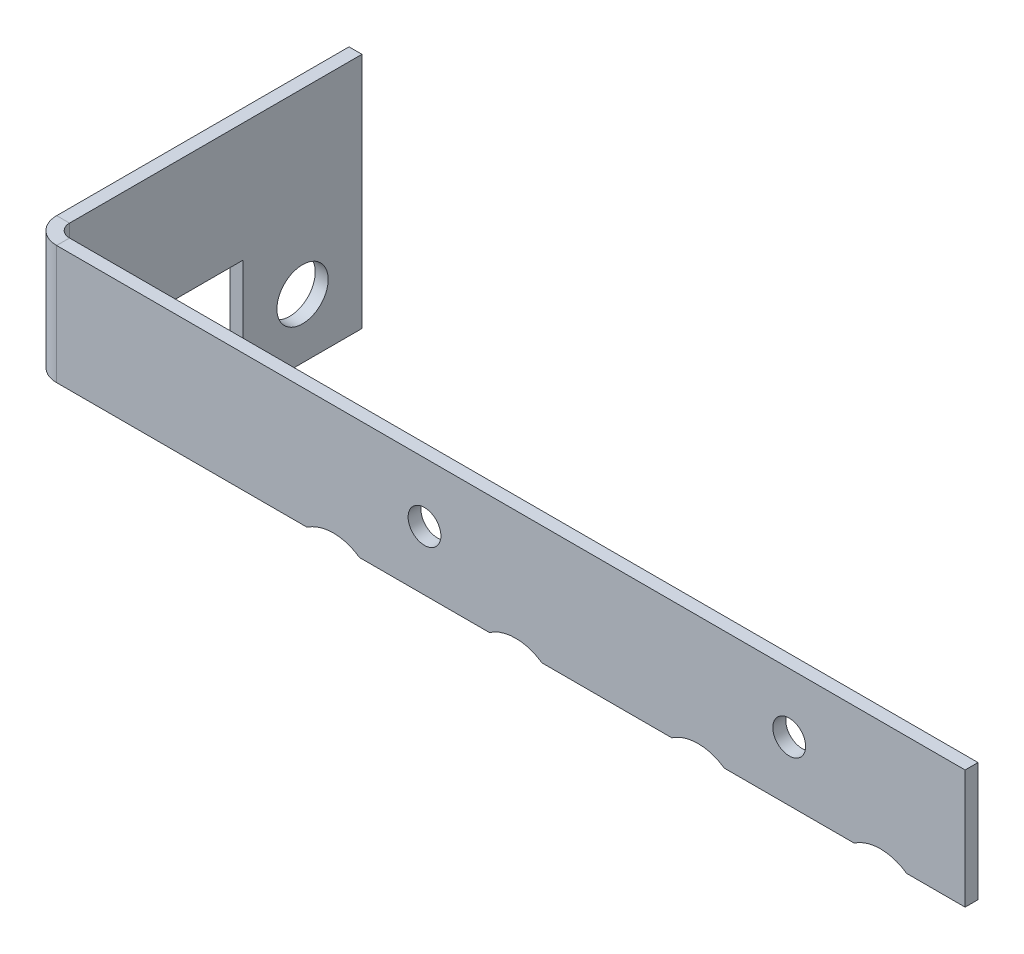
ISO-10303-21;
HEADER;
FILE_DESCRIPTION(('STEP AP214'),'2;1');
FILE_NAME('part.step','',(''),(''),'','','');
FILE_SCHEMA(('AUTOMOTIVE_DESIGN { 1 0 10303 214 1 1 1 1 }'));
ENDSEC;
DATA;
#1=APPLICATION_CONTEXT('core data for automotive mechanical design processes');
#2=APPLICATION_PROTOCOL_DEFINITION('international standard','automotive_design',2000,#1);
#3=PRODUCT_CONTEXT('',#1,'mechanical');
#4=PRODUCT('Part','Part','',(#3));
#5=PRODUCT_RELATED_PRODUCT_CATEGORY('part','',(#4));
#6=PRODUCT_DEFINITION_FORMATION('','',#4);
#7=PRODUCT_DEFINITION_CONTEXT('part definition',#1,'design');
#8=PRODUCT_DEFINITION('design','',#6,#7);
#9=PRODUCT_DEFINITION_SHAPE('','',#8);
#10=(LENGTH_UNIT() NAMED_UNIT(*) SI_UNIT(.MILLI.,.METRE.));
#11=(NAMED_UNIT(*) PLANE_ANGLE_UNIT() SI_UNIT($,.RADIAN.));
#12=(NAMED_UNIT(*) SI_UNIT($,.STERADIAN.) SOLID_ANGLE_UNIT());
#13=UNCERTAINTY_MEASURE_WITH_UNIT(LENGTH_MEASURE(1.E-05),#10,'distance_accuracy_value','');
#14=(GEOMETRIC_REPRESENTATION_CONTEXT(3) GLOBAL_UNCERTAINTY_ASSIGNED_CONTEXT((#13)) GLOBAL_UNIT_ASSIGNED_CONTEXT((#10,
#11,#12)) REPRESENTATION_CONTEXT('',''));
#15=CARTESIAN_POINT('',(0.,0.,0.));
#16=DIRECTION('',(0.,0.,1.));
#17=DIRECTION('',(1.,0.,0.));
#18=AXIS2_PLACEMENT_3D('',#15,#16,#17);
#19=CARTESIAN_POINT('',(-10.5,19.430000002,0.));
#20=DIRECTION('',(0.,1.,0.));
#21=DIRECTION('',(-1.,0.,0.));
#22=AXIS2_PLACEMENT_3D('',#19,#20,#21);
#23=PLANE('',#22);
#24=DIRECTION('',(-1.,0.,0.));
#25=VECTOR('',#24,1.);
#26=CARTESIAN_POINT('',(-10.5,19.430000002,0.));
#27=LINE('',#26,#25);
#28=CARTESIAN_POINT('',(78.3179999999999,19.430000002,0.));
#29=VERTEX_POINT('',#28);
#30=CARTESIAN_POINT('',(-34.299999898,19.430000002,0.));
#31=VERTEX_POINT('',#30);
#32=EDGE_CURVE('E244',#29,#31,#27,.T.);
#33=ORIENTED_EDGE('',*,*,#32,.T.);
#34=DIRECTION('',(0.,0.,1.));
#35=VECTOR('',#34,1.);
#36=CARTESIAN_POINT('',(-34.299999898,19.430000002,0.));
#37=LINE('',#36,#35);
#38=CARTESIAN_POINT('',(-34.299999898,19.430000002,1.600000102));
#39=VERTEX_POINT('',#38);
#40=EDGE_CURVE('E270',#31,#39,#37,.T.);
#41=ORIENTED_EDGE('',*,*,#40,.T.);
#42=DIRECTION('',(1.,0.,0.));
#43=VECTOR('',#42,1.);
#44=CARTESIAN_POINT('',(22.606,19.430000002,1.600000102));
#45=LINE('',#44,#43);
#46=CARTESIAN_POINT('',(78.3179999999999,19.430000002,1.600000102));
#47=VERTEX_POINT('',#46);
#48=EDGE_CURVE('E204',#47,#39,#45,.F.);
#49=ORIENTED_EDGE('',*,*,#48,.F.);
#50=DIRECTION('',(0.,0.,-1.));
#51=VECTOR('',#50,1.);
#52=CARTESIAN_POINT('',(78.3179999999999,19.430000002,0.));
#53=LINE('',#52,#51);
#54=EDGE_CURVE('E226',#47,#29,#53,.T.);
#55=ORIENTED_EDGE('',*,*,#54,.T.);
#56=EDGE_LOOP('',(#33,#41,#49,#55));
#57=FACE_BOUND('',#56,.T.);
#58=ADVANCED_FACE('F38',(#57),#23,.T.);
#59=CARTESIAN_POINT('',(22.606,0.,0.));
#60=DIRECTION('',(0.,0.,1.));
#61=DIRECTION('',(1.,0.,0.));
#62=AXIS2_PLACEMENT_3D('',#59,#60,#61);
#63=PLANE('',#62);
#64=CARTESIAN_POINT('',(56.5149999999999,12.065,0.));
#65=DIRECTION('',(0.,0.,1.));
#66=DIRECTION('',(1.,0.,0.));
#67=AXIS2_PLACEMENT_3D('',#64,#65,#66);
#68=CIRCLE('',#67,2.032);
#69=CARTESIAN_POINT('',(58.5469999999999,12.065,0.));
#70=VERTEX_POINT('',#69);
#71=EDGE_CURVE('E180',#70,#70,#68,.T.);
#72=ORIENTED_EDGE('',*,*,#71,.T.);
#73=EDGE_LOOP('',(#72));
#74=FACE_BOUND('',#73,.T.);
#75=CARTESIAN_POINT('',(11.3029999999999,12.065,0.));
#76=DIRECTION('',(0.,0.,1.));
#77=DIRECTION('',(1.,0.,0.));
#78=AXIS2_PLACEMENT_3D('',#75,#76,#77);
#79=CIRCLE('',#78,2.032);
#80=CARTESIAN_POINT('',(13.3349999999999,12.065,0.));
#81=VERTEX_POINT('',#80);
#82=EDGE_CURVE('E174',#81,#81,#79,.T.);
#83=ORIENTED_EDGE('',*,*,#82,.T.);
#84=EDGE_LOOP('',(#83));
#85=FACE_BOUND('',#84,.T.);
#86=DIRECTION('',(0.,1.,0.));
#87=VECTOR('',#86,1.);
#88=CARTESIAN_POINT('',(-34.299999898,19.430000002,0.));
#89=LINE('',#88,#87);
#90=CARTESIAN_POINT('',(-34.299999898,4.699999998,0.));
#91=VERTEX_POINT('',#90);
#92=EDGE_CURVE('E278',#31,#91,#89,.F.);
#93=ORIENTED_EDGE('',*,*,#92,.F.);
#94=ORIENTED_EDGE('',*,*,#32,.F.);
#95=DIRECTION('',(0.,1.,0.));
#96=VECTOR('',#95,1.);
#97=CARTESIAN_POINT('',(78.3179999999999,4.699999998,0.));
#98=LINE('',#97,#96);
#99=CARTESIAN_POINT('',(78.3179999999999,4.699999998,0.));
#100=VERTEX_POINT('',#99);
#101=EDGE_CURVE('E251',#100,#29,#98,.T.);
#102=ORIENTED_EDGE('',*,*,#101,.F.);
#103=DIRECTION('',(1.,0.,0.));
#104=VECTOR('',#103,1.);
#105=CARTESIAN_POINT('',(71.07109944452,4.699999998,0.));
#106=LINE('',#105,#104);
#107=CARTESIAN_POINT('',(71.07109944452,4.699999998,0.));
#108=VERTEX_POINT('',#107);
#109=EDGE_CURVE('E254',#108,#100,#106,.T.);
#110=ORIENTED_EDGE('',*,*,#109,.F.);
#111=CARTESIAN_POINT('',(67.818,0.,0.));
#112=DIRECTION('',(0.,0.,-1.));
#113=DIRECTION('',(1.,0.,0.));
#114=AXIS2_PLACEMENT_3D('',#111,#112,#113);
#115=CIRCLE('',#114,5.715999998);
#116=CARTESIAN_POINT('',(64.5649005554801,4.699999998,0.));
#117=VERTEX_POINT('',#116);
#118=EDGE_CURVE('E169',#117,#108,#115,.T.);
#119=ORIENTED_EDGE('',*,*,#118,.F.);
#120=DIRECTION('',(1.,0.,0.));
#121=VECTOR('',#120,1.);
#122=CARTESIAN_POINT('',(48.46509944452,4.699999998,0.));
#123=LINE('',#122,#121);
#124=CARTESIAN_POINT('',(48.46509944452,4.699999998,0.));
#125=VERTEX_POINT('',#124);
#126=EDGE_CURVE('E150',#125,#117,#123,.T.);
#127=ORIENTED_EDGE('',*,*,#126,.F.);
#128=CARTESIAN_POINT('',(45.212,0.,0.));
#129=DIRECTION('',(0.,0.,-1.));
#130=DIRECTION('',(1.,0.,0.));
#131=AXIS2_PLACEMENT_3D('',#128,#129,#130);
#132=CIRCLE('',#131,5.715999998);
#133=CARTESIAN_POINT('',(41.95890055548,4.699999998,0.));
#134=VERTEX_POINT('',#133);
#135=EDGE_CURVE('E166',#134,#125,#132,.T.);
#136=ORIENTED_EDGE('',*,*,#135,.F.);
#137=DIRECTION('',(1.,0.,0.));
#138=VECTOR('',#137,1.);
#139=CARTESIAN_POINT('',(25.85909944452,4.699999998,0.));
#140=LINE('',#139,#138);
#141=CARTESIAN_POINT('',(25.85909944452,4.699999998,0.));
#142=VERTEX_POINT('',#141);
#143=EDGE_CURVE('E172',#142,#134,#140,.T.);
#144=ORIENTED_EDGE('',*,*,#143,.F.);
#145=CARTESIAN_POINT('',(22.606,0.,0.));
#146=DIRECTION('',(0.,0.,-1.));
#147=DIRECTION('',(1.,0.,0.));
#148=AXIS2_PLACEMENT_3D('',#145,#146,#147);
#149=CIRCLE('',#148,5.715999998);
#150=CARTESIAN_POINT('',(19.3529005554801,4.699999998,0.));
#151=VERTEX_POINT('',#150);
#152=EDGE_CURVE('E218',#151,#142,#149,.T.);
#153=ORIENTED_EDGE('',*,*,#152,.F.);
#154=DIRECTION('',(1.,0.,0.));
#155=VECTOR('',#154,1.);
#156=CARTESIAN_POINT('',(3.25309944451995,4.699999998,0.));
#157=LINE('',#156,#155);
#158=CARTESIAN_POINT('',(3.25309944451995,4.699999998,0.));
#159=VERTEX_POINT('',#158);
#160=EDGE_CURVE('E242',#159,#151,#157,.T.);
#161=ORIENTED_EDGE('',*,*,#160,.F.);
#162=CARTESIAN_POINT('',(0.,0.,0.));
#163=DIRECTION('',(0.,0.,-1.));
#164=DIRECTION('',(1.,0.,0.));
#165=AXIS2_PLACEMENT_3D('',#162,#163,#164);
#166=CIRCLE('',#165,5.715999998);
#167=CARTESIAN_POINT('',(-3.25309944451995,4.699999998,0.));
#168=VERTEX_POINT('',#167);
#169=EDGE_CURVE('E235',#168,#159,#166,.T.);
#170=ORIENTED_EDGE('',*,*,#169,.F.);
#171=DIRECTION('',(1.,0.,0.));
#172=VECTOR('',#171,1.);
#173=CARTESIAN_POINT('',(-10.5,4.699999998,0.));
#174=LINE('',#173,#172);
#175=EDGE_CURVE('E240',#91,#168,#174,.T.);
#176=ORIENTED_EDGE('',*,*,#175,.F.);
#177=EDGE_LOOP('',(#93,#94,#102,#110,#119,#127,#136,#144,#153,#161,#170,#176));
#178=FACE_BOUND('',#177,.T.);
#179=ADVANCED_FACE('F164',(#74,#85,#178),#63,.F.);
#180=CARTESIAN_POINT('',(22.606,0.,1.600000102));
#181=DIRECTION('',(0.,0.,1.));
#182=DIRECTION('',(1.,0.,0.));
#183=AXIS2_PLACEMENT_3D('',#180,#181,#182);
#184=PLANE('',#183);
#185=CARTESIAN_POINT('',(11.3029999999999,12.065,1.600000102));
#186=DIRECTION('',(0.,0.,1.));
#187=DIRECTION('',(1.,0.,0.));
#188=AXIS2_PLACEMENT_3D('',#185,#186,#187);
#189=CIRCLE('',#188,2.032);
#190=CARTESIAN_POINT('',(13.3349999999999,12.065,1.600000102));
#191=VERTEX_POINT('',#190);
#192=EDGE_CURVE('E191',#191,#191,#189,.T.);
#193=ORIENTED_EDGE('',*,*,#192,.F.);
#194=EDGE_LOOP('',(#193));
#195=FACE_BOUND('',#194,.T.);
#196=CARTESIAN_POINT('',(56.5149999999999,12.065,1.600000102));
#197=DIRECTION('',(0.,0.,1.));
#198=DIRECTION('',(1.,0.,0.));
#199=AXIS2_PLACEMENT_3D('',#196,#197,#198);
#200=CIRCLE('',#199,2.032);
#201=CARTESIAN_POINT('',(58.5469999999999,12.065,1.600000102));
#202=VERTEX_POINT('',#201);
#203=EDGE_CURVE('E215',#202,#202,#200,.T.);
#204=ORIENTED_EDGE('',*,*,#203,.F.);
#205=EDGE_LOOP('',(#204));
#206=FACE_BOUND('',#205,.T.);
#207=ORIENTED_EDGE('',*,*,#48,.T.);
#208=DIRECTION('',(0.,1.,0.));
#209=VECTOR('',#208,1.);
#210=CARTESIAN_POINT('',(-34.299999898,19.430000002,1.600000102));
#211=LINE('',#210,#209);
#212=CARTESIAN_POINT('',(-34.299999898,4.699999998,1.600000102));
#213=VERTEX_POINT('',#212);
#214=EDGE_CURVE('E108',#39,#213,#211,.F.);
#215=ORIENTED_EDGE('',*,*,#214,.T.);
#216=DIRECTION('',(1.,0.,0.));
#217=VECTOR('',#216,1.);
#218=CARTESIAN_POINT('',(22.606,4.699999998,1.600000102));
#219=LINE('',#218,#217);
#220=CARTESIAN_POINT('',(-3.25309944451995,4.699999998,1.600000102));
#221=VERTEX_POINT('',#220);
#222=EDGE_CURVE('E207',#213,#221,#219,.T.);
#223=ORIENTED_EDGE('',*,*,#222,.T.);
#224=CARTESIAN_POINT('',(0.,0.,1.600000102));
#225=DIRECTION('',(0.,0.,-1.));
#226=DIRECTION('',(-1.,0.,0.));
#227=AXIS2_PLACEMENT_3D('',#224,#225,#226);
#228=CIRCLE('',#227,5.715999998);
#229=CARTESIAN_POINT('',(3.25309944451995,4.699999998,1.600000102));
#230=VERTEX_POINT('',#229);
#231=EDGE_CURVE('E209',#221,#230,#228,.T.);
#232=ORIENTED_EDGE('',*,*,#231,.T.);
#233=DIRECTION('',(1.,0.,0.));
#234=VECTOR('',#233,1.);
#235=CARTESIAN_POINT('',(22.606,4.699999998,1.600000102));
#236=LINE('',#235,#234);
#237=CARTESIAN_POINT('',(19.3529005554801,4.699999998,1.600000102));
#238=VERTEX_POINT('',#237);
#239=EDGE_CURVE('E186',#230,#238,#236,.T.);
#240=ORIENTED_EDGE('',*,*,#239,.T.);
#241=CARTESIAN_POINT('',(22.606,0.,1.600000102));
#242=DIRECTION('',(0.,0.,-1.));
#243=DIRECTION('',(-1.,0.,0.));
#244=AXIS2_PLACEMENT_3D('',#241,#242,#243);
#245=CIRCLE('',#244,5.715999998);
#246=CARTESIAN_POINT('',(25.85909944452,4.699999998,1.600000102));
#247=VERTEX_POINT('',#246);
#248=EDGE_CURVE('E183',#238,#247,#245,.T.);
#249=ORIENTED_EDGE('',*,*,#248,.T.);
#250=DIRECTION('',(1.,0.,0.));
#251=VECTOR('',#250,1.);
#252=CARTESIAN_POINT('',(22.606,4.699999998,1.600000102));
#253=LINE('',#252,#251);
#254=CARTESIAN_POINT('',(41.95890055548,4.699999998,1.600000102));
#255=VERTEX_POINT('',#254);
#256=EDGE_CURVE('E188',#247,#255,#253,.T.);
#257=ORIENTED_EDGE('',*,*,#256,.T.);
#258=CARTESIAN_POINT('',(45.212,0.,1.600000102));
#259=DIRECTION('',(0.,0.,-1.));
#260=DIRECTION('',(-1.,0.,0.));
#261=AXIS2_PLACEMENT_3D('',#258,#259,#260);
#262=CIRCLE('',#261,5.715999998);
#263=CARTESIAN_POINT('',(48.46509944452,4.699999998,1.600000102));
#264=VERTEX_POINT('',#263);
#265=EDGE_CURVE('E192',#255,#264,#262,.T.);
#266=ORIENTED_EDGE('',*,*,#265,.T.);
#267=DIRECTION('',(1.,0.,0.));
#268=VECTOR('',#267,1.);
#269=CARTESIAN_POINT('',(22.606,4.699999998,1.600000102));
#270=LINE('',#269,#268);
#271=CARTESIAN_POINT('',(64.5649005554801,4.699999998,1.600000102));
#272=VERTEX_POINT('',#271);
#273=EDGE_CURVE('E152',#264,#272,#270,.T.);
#274=ORIENTED_EDGE('',*,*,#273,.T.);
#275=CARTESIAN_POINT('',(67.818,0.,1.600000102));
#276=DIRECTION('',(0.,0.,-1.));
#277=DIRECTION('',(-1.,0.,0.));
#278=AXIS2_PLACEMENT_3D('',#275,#276,#277);
#279=CIRCLE('',#278,5.715999998);
#280=CARTESIAN_POINT('',(71.07109944452,4.699999998,1.600000102));
#281=VERTEX_POINT('',#280);
#282=EDGE_CURVE('E195',#272,#281,#279,.T.);
#283=ORIENTED_EDGE('',*,*,#282,.T.);
#284=DIRECTION('',(1.,0.,0.));
#285=VECTOR('',#284,1.);
#286=CARTESIAN_POINT('',(22.606,4.699999998,1.600000102));
#287=LINE('',#286,#285);
#288=CARTESIAN_POINT('',(78.3179999999999,4.699999998,1.600000102));
#289=VERTEX_POINT('',#288);
#290=EDGE_CURVE('E198',#281,#289,#287,.T.);
#291=ORIENTED_EDGE('',*,*,#290,.T.);
#292=DIRECTION('',(0.,1.,0.));
#293=VECTOR('',#292,1.);
#294=CARTESIAN_POINT('',(78.3179999999999,0.,1.600000102));
#295=LINE('',#294,#293);
#296=EDGE_CURVE('E201',#289,#47,#295,.T.);
#297=ORIENTED_EDGE('',*,*,#296,.T.);
#298=EDGE_LOOP('',(#207,#215,#223,#232,#240,#249,#257,#266,#274,#283,#291,#297));
#299=FACE_BOUND('',#298,.T.);
#300=ADVANCED_FACE('F260',(#195,#206,#299),#184,.T.);
#301=CARTESIAN_POINT('',(0.,0.,0.));
#302=DIRECTION('',(0.,0.,1.));
#303=DIRECTION('',(1.,0.,0.));
#304=AXIS2_PLACEMENT_3D('',#301,#302,#303);
#305=CYLINDRICAL_SURFACE('',#304,5.715999998);
#306=DIRECTION('',(0.,0.,-1.));
#307=VECTOR('',#306,1.);
#308=CARTESIAN_POINT('',(3.25309944451995,4.699999998,0.));
#309=LINE('',#308,#307);
#310=EDGE_CURVE('E11',#230,#159,#309,.T.);
#311=ORIENTED_EDGE('',*,*,#310,.F.);
#312=ORIENTED_EDGE('',*,*,#231,.F.);
#313=DIRECTION('',(0.,0.,-1.));
#314=VECTOR('',#313,1.);
#315=CARTESIAN_POINT('',(-3.25309944451995,4.699999998,0.));
#316=LINE('',#315,#314);
#317=EDGE_CURVE('E47',#221,#168,#316,.T.);
#318=ORIENTED_EDGE('',*,*,#317,.T.);
#319=ORIENTED_EDGE('',*,*,#169,.T.);
#320=EDGE_LOOP('',(#311,#312,#318,#319));
#321=FACE_BOUND('',#320,.T.);
#322=ADVANCED_FACE('F234',(#321),#305,.F.);
#323=CARTESIAN_POINT('',(-10.5,4.699999998,0.));
#324=DIRECTION('',(0.,-1.,0.));
#325=DIRECTION('',(1.,0.,0.));
#326=AXIS2_PLACEMENT_3D('',#323,#324,#325);
#327=PLANE('',#326);
#328=DIRECTION('',(0.,0.,1.));
#329=VECTOR('',#328,1.);
#330=CARTESIAN_POINT('',(-34.299999898,4.699999998,0.));
#331=LINE('',#330,#329);
#332=EDGE_CURVE('E187',#91,#213,#331,.T.);
#333=ORIENTED_EDGE('',*,*,#332,.F.);
#334=ORIENTED_EDGE('',*,*,#175,.T.);
#335=ORIENTED_EDGE('',*,*,#317,.F.);
#336=ORIENTED_EDGE('',*,*,#222,.F.);
#337=EDGE_LOOP('',(#333,#334,#335,#336));
#338=FACE_BOUND('',#337,.T.);
#339=ADVANCED_FACE('F267',(#338),#327,.T.);
#340=CARTESIAN_POINT('',(78.3179999999999,4.699999998,0.));
#341=DIRECTION('',(1.,0.,0.));
#342=DIRECTION('',(0.,1.,0.));
#343=AXIS2_PLACEMENT_3D('',#340,#341,#342);
#344=PLANE('',#343);
#345=ORIENTED_EDGE('',*,*,#54,.F.);
#346=ORIENTED_EDGE('',*,*,#296,.F.);
#347=DIRECTION('',(0.,0.,-1.));
#348=VECTOR('',#347,1.);
#349=CARTESIAN_POINT('',(78.3179999999999,4.699999998,0.));
#350=LINE('',#349,#348);
#351=EDGE_CURVE('E224',#289,#100,#350,.T.);
#352=ORIENTED_EDGE('',*,*,#351,.T.);
#353=ORIENTED_EDGE('',*,*,#101,.T.);
#354=EDGE_LOOP('',(#345,#346,#352,#353));
#355=FACE_BOUND('',#354,.T.);
#356=ADVANCED_FACE('F390',(#355),#344,.T.);
#357=CARTESIAN_POINT('',(71.07109944452,4.699999998,0.));
#358=DIRECTION('',(0.,-1.,0.));
#359=DIRECTION('',(1.,0.,0.));
#360=AXIS2_PLACEMENT_3D('',#357,#358,#359);
#361=PLANE('',#360);
#362=ORIENTED_EDGE('',*,*,#351,.F.);
#363=ORIENTED_EDGE('',*,*,#290,.F.);
#364=DIRECTION('',(0.,0.,-1.));
#365=VECTOR('',#364,1.);
#366=CARTESIAN_POINT('',(71.07109944452,4.699999998,0.));
#367=LINE('',#366,#365);
#368=EDGE_CURVE('E222',#281,#108,#367,.T.);
#369=ORIENTED_EDGE('',*,*,#368,.T.);
#370=ORIENTED_EDGE('',*,*,#109,.T.);
#371=EDGE_LOOP('',(#362,#363,#369,#370));
#372=FACE_BOUND('',#371,.T.);
#373=ADVANCED_FACE('F459',(#372),#361,.T.);
#374=CARTESIAN_POINT('',(67.818,0.,0.));
#375=DIRECTION('',(0.,0.,1.));
#376=DIRECTION('',(1.,0.,0.));
#377=AXIS2_PLACEMENT_3D('',#374,#375,#376);
#378=CYLINDRICAL_SURFACE('',#377,5.715999998);
#379=ORIENTED_EDGE('',*,*,#368,.F.);
#380=ORIENTED_EDGE('',*,*,#282,.F.);
#381=DIRECTION('',(0.,0.,-1.));
#382=VECTOR('',#381,1.);
#383=CARTESIAN_POINT('',(64.5649005554801,4.699999998,0.));
#384=LINE('',#383,#382);
#385=EDGE_CURVE('E157',#272,#117,#384,.T.);
#386=ORIENTED_EDGE('',*,*,#385,.T.);
#387=ORIENTED_EDGE('',*,*,#118,.T.);
#388=EDGE_LOOP('',(#379,#380,#386,#387));
#389=FACE_BOUND('',#388,.T.);
#390=ADVANCED_FACE('F257',(#389),#378,.F.);
#391=CARTESIAN_POINT('',(48.46509944452,4.699999998,0.));
#392=DIRECTION('',(0.,-1.,0.));
#393=DIRECTION('',(1.,0.,0.));
#394=AXIS2_PLACEMENT_3D('',#391,#392,#393);
#395=PLANE('',#394);
#396=ORIENTED_EDGE('',*,*,#385,.F.);
#397=ORIENTED_EDGE('',*,*,#273,.F.);
#398=DIRECTION('',(0.,0.,-1.));
#399=VECTOR('',#398,1.);
#400=CARTESIAN_POINT('',(48.46509944452,4.699999998,0.));
#401=LINE('',#400,#399);
#402=EDGE_CURVE('E147',#264,#125,#401,.T.);
#403=ORIENTED_EDGE('',*,*,#402,.T.);
#404=ORIENTED_EDGE('',*,*,#126,.T.);
#405=EDGE_LOOP('',(#396,#397,#403,#404));
#406=FACE_BOUND('',#405,.T.);
#407=ADVANCED_FACE('F149',(#406),#395,.T.);
#408=CARTESIAN_POINT('',(45.212,0.,0.));
#409=DIRECTION('',(0.,0.,1.));
#410=DIRECTION('',(1.,0.,0.));
#411=AXIS2_PLACEMENT_3D('',#408,#409,#410);
#412=CYLINDRICAL_SURFACE('',#411,5.715999998);
#413=ORIENTED_EDGE('',*,*,#402,.F.);
#414=ORIENTED_EDGE('',*,*,#265,.F.);
#415=DIRECTION('',(0.,0.,-1.));
#416=VECTOR('',#415,1.);
#417=CARTESIAN_POINT('',(41.95890055548,4.699999998,0.));
#418=LINE('',#417,#416);
#419=EDGE_CURVE('E158',#255,#134,#418,.T.);
#420=ORIENTED_EDGE('',*,*,#419,.T.);
#421=ORIENTED_EDGE('',*,*,#135,.T.);
#422=EDGE_LOOP('',(#413,#414,#420,#421));
#423=FACE_BOUND('',#422,.T.);
#424=ADVANCED_FACE('F171',(#423),#412,.F.);
#425=CARTESIAN_POINT('',(25.85909944452,4.699999998,0.));
#426=DIRECTION('',(0.,-1.,0.));
#427=DIRECTION('',(1.,0.,0.));
#428=AXIS2_PLACEMENT_3D('',#425,#426,#427);
#429=PLANE('',#428);
#430=ORIENTED_EDGE('',*,*,#419,.F.);
#431=ORIENTED_EDGE('',*,*,#256,.F.);
#432=DIRECTION('',(0.,0.,-1.));
#433=VECTOR('',#432,1.);
#434=CARTESIAN_POINT('',(25.85909944452,4.699999998,0.));
#435=LINE('',#434,#433);
#436=EDGE_CURVE('E63',#247,#142,#435,.T.);
#437=ORIENTED_EDGE('',*,*,#436,.T.);
#438=ORIENTED_EDGE('',*,*,#143,.T.);
#439=EDGE_LOOP('',(#430,#431,#437,#438));
#440=FACE_BOUND('',#439,.T.);
#441=ADVANCED_FACE('F263',(#440),#429,.T.);
#442=CARTESIAN_POINT('',(22.606,0.,0.));
#443=DIRECTION('',(0.,0.,1.));
#444=DIRECTION('',(1.,0.,0.));
#445=AXIS2_PLACEMENT_3D('',#442,#443,#444);
#446=CYLINDRICAL_SURFACE('',#445,5.715999998);
#447=ORIENTED_EDGE('',*,*,#436,.F.);
#448=ORIENTED_EDGE('',*,*,#248,.F.);
#449=DIRECTION('',(0.,0.,-1.));
#450=VECTOR('',#449,1.);
#451=CARTESIAN_POINT('',(19.3529005554801,4.699999998,0.));
#452=LINE('',#451,#450);
#453=EDGE_CURVE('E42',#238,#151,#452,.T.);
#454=ORIENTED_EDGE('',*,*,#453,.T.);
#455=ORIENTED_EDGE('',*,*,#152,.T.);
#456=EDGE_LOOP('',(#447,#448,#454,#455));
#457=FACE_BOUND('',#456,.T.);
#458=ADVANCED_FACE('F430',(#457),#446,.F.);
#459=CARTESIAN_POINT('',(3.25309944451995,4.699999998,0.));
#460=DIRECTION('',(0.,-1.,0.));
#461=DIRECTION('',(1.,0.,0.));
#462=AXIS2_PLACEMENT_3D('',#459,#460,#461);
#463=PLANE('',#462);
#464=ORIENTED_EDGE('',*,*,#239,.F.);
#465=ORIENTED_EDGE('',*,*,#310,.T.);
#466=ORIENTED_EDGE('',*,*,#160,.T.);
#467=ORIENTED_EDGE('',*,*,#453,.F.);
#468=EDGE_LOOP('',(#464,#465,#466,#467));
#469=FACE_BOUND('',#468,.T.);
#470=ADVANCED_FACE('F265',(#469),#463,.T.);
#471=CARTESIAN_POINT('',(11.3029999999999,12.065,0.));
#472=DIRECTION('',(0.,0.,1.));
#473=DIRECTION('',(1.,0.,0.));
#474=AXIS2_PLACEMENT_3D('',#471,#472,#473);
#475=CYLINDRICAL_SURFACE('',#474,2.032);
#476=ORIENTED_EDGE('',*,*,#82,.F.);
#477=EDGE_LOOP('',(#476));
#478=FACE_BOUND('',#477,.T.);
#479=ORIENTED_EDGE('',*,*,#192,.T.);
#480=EDGE_LOOP('',(#479));
#481=FACE_BOUND('',#480,.T.);
#482=ADVANCED_FACE('F429',(#478,#481),#475,.F.);
#483=CARTESIAN_POINT('',(56.5149999999999,12.065,0.));
#484=DIRECTION('',(0.,0.,1.));
#485=DIRECTION('',(1.,0.,0.));
#486=AXIS2_PLACEMENT_3D('',#483,#484,#485);
#487=CYLINDRICAL_SURFACE('',#486,2.032);
#488=ORIENTED_EDGE('',*,*,#71,.F.);
#489=EDGE_LOOP('',(#488));
#490=FACE_BOUND('',#489,.T.);
#491=ORIENTED_EDGE('',*,*,#203,.T.);
#492=EDGE_LOOP('',(#491));
#493=FACE_BOUND('',#492,.T.);
#494=ADVANCED_FACE('F40',(#490,#493),#487,.F.);
#495=CARTESIAN_POINT('',(-34.299999898,4.699999998,-1.600000102));
#496=DIRECTION('',(0.,-1.,0.));
#497=DIRECTION('',(0.,0.,-1.));
#498=AXIS2_PLACEMENT_3D('',#495,#496,#497);
#499=PLANE('',#498);
#500=DIRECTION('',(-1.,0.,0.));
#501=VECTOR('',#500,1.);
#502=CARTESIAN_POINT('',(-35.9,4.699999998,-1.600000102));
#503=LINE('',#502,#501);
#504=CARTESIAN_POINT('',(-35.9,4.699999998,-1.600000102));
#505=VERTEX_POINT('',#504);
#506=CARTESIAN_POINT('',(-37.500000102,4.699999998,-1.60000010199999));
#507=VERTEX_POINT('',#506);
#508=EDGE_CURVE('E338',#505,#507,#503,.T.);
#509=ORIENTED_EDGE('',*,*,#508,.F.);
#510=CARTESIAN_POINT('',(-34.299999898,4.699999998,-1.600000102));
#511=DIRECTION('',(0.,1.,0.));
#512=DIRECTION('',(0.,0.,1.));
#513=AXIS2_PLACEMENT_3D('',#510,#511,#512);
#514=CIRCLE('',#513,1.600000102);
#515=EDGE_CURVE('E281',#91,#505,#514,.F.);
#516=ORIENTED_EDGE('',*,*,#515,.F.);
#517=ORIENTED_EDGE('',*,*,#332,.T.);
#518=CARTESIAN_POINT('',(-34.299999898,4.699999998,-1.600000102));
#519=DIRECTION('',(0.,1.,0.));
#520=DIRECTION('',(0.,0.,1.));
#521=AXIS2_PLACEMENT_3D('',#518,#519,#520);
#522=CIRCLE('',#521,3.200000204);
#523=EDGE_CURVE('E54',#213,#507,#522,.F.);
#524=ORIENTED_EDGE('',*,*,#523,.T.);
#525=EDGE_LOOP('',(#509,#516,#517,#524));
#526=FACE_BOUND('',#525,.T.);
#527=ADVANCED_FACE('F392',(#526),#499,.T.);
#528=CARTESIAN_POINT('',(-34.299999898,19.430000002,-1.600000102));
#529=DIRECTION('',(0.,-1.,0.));
#530=DIRECTION('',(0.,0.,-1.));
#531=AXIS2_PLACEMENT_3D('',#528,#529,#530);
#532=PLANE('',#531);
#533=CARTESIAN_POINT('',(-34.299999898,19.430000002,-1.600000102));
#534=DIRECTION('',(0.,1.,0.));
#535=DIRECTION('',(0.,0.,1.));
#536=AXIS2_PLACEMENT_3D('',#533,#534,#535);
#537=CIRCLE('',#536,1.600000102);
#538=CARTESIAN_POINT('',(-35.9,19.430000002,-1.600000102));
#539=VERTEX_POINT('',#538);
#540=EDGE_CURVE('E275',#539,#31,#537,.T.);
#541=ORIENTED_EDGE('',*,*,#540,.F.);
#542=DIRECTION('',(-1.,0.,0.));
#543=VECTOR('',#542,1.);
#544=CARTESIAN_POINT('',(-35.9,19.430000002,-1.600000102));
#545=LINE('',#544,#543);
#546=CARTESIAN_POINT('',(-37.500000102,19.430000002,-1.60000010199999));
#547=VERTEX_POINT('',#546);
#548=EDGE_CURVE('E337',#539,#547,#545,.T.);
#549=ORIENTED_EDGE('',*,*,#548,.T.);
#550=CARTESIAN_POINT('',(-34.299999898,19.430000002,-1.600000102));
#551=DIRECTION('',(0.,1.,0.));
#552=DIRECTION('',(0.,0.,1.));
#553=AXIS2_PLACEMENT_3D('',#550,#551,#552);
#554=CIRCLE('',#553,3.200000204);
#555=EDGE_CURVE('E284',#547,#39,#554,.T.);
#556=ORIENTED_EDGE('',*,*,#555,.T.);
#557=ORIENTED_EDGE('',*,*,#40,.F.);
#558=EDGE_LOOP('',(#541,#549,#556,#557));
#559=FACE_BOUND('',#558,.T.);
#560=ADVANCED_FACE('F353',(#559),#532,.F.);
#561=CARTESIAN_POINT('',(-34.299999898,19.430000002,-1.600000102));
#562=DIRECTION('',(0.,1.,0.));
#563=DIRECTION('',(-1.,0.,0.));
#564=AXIS2_PLACEMENT_3D('',#561,#562,#563);
#565=CYLINDRICAL_SURFACE('',#564,3.200000204);
#566=ORIENTED_EDGE('',*,*,#214,.F.);
#567=ORIENTED_EDGE('',*,*,#555,.F.);
#568=DIRECTION('',(0.,-1.,0.));
#569=VECTOR('',#568,1.);
#570=CARTESIAN_POINT('',(-37.500000102,0.,-1.60000010199999));
#571=LINE('',#570,#569);
#572=EDGE_CURVE('E333',#547,#507,#571,.T.);
#573=ORIENTED_EDGE('',*,*,#572,.T.);
#574=ORIENTED_EDGE('',*,*,#523,.F.);
#575=EDGE_LOOP('',(#566,#567,#573,#574));
#576=FACE_BOUND('',#575,.T.);
#577=ADVANCED_FACE('F384',(#576),#565,.T.);
#578=CARTESIAN_POINT('',(-34.299999898,19.430000002,-1.600000102));
#579=DIRECTION('',(0.,1.,0.));
#580=DIRECTION('',(-1.,0.,0.));
#581=AXIS2_PLACEMENT_3D('',#578,#579,#580);
#582=CYLINDRICAL_SURFACE('',#581,1.600000102);
#583=ORIENTED_EDGE('',*,*,#92,.T.);
#584=ORIENTED_EDGE('',*,*,#515,.T.);
#585=DIRECTION('',(0.,1.,0.));
#586=VECTOR('',#585,1.);
#587=CARTESIAN_POINT('',(-35.9,4.699999998,-1.600000102));
#588=LINE('',#587,#586);
#589=EDGE_CURVE('E341',#505,#539,#588,.T.);
#590=ORIENTED_EDGE('',*,*,#589,.T.);
#591=ORIENTED_EDGE('',*,*,#540,.T.);
#592=EDGE_LOOP('',(#583,#584,#590,#591));
#593=FACE_BOUND('',#592,.T.);
#594=ADVANCED_FACE('F347',(#593),#582,.F.);
#595=CARTESIAN_POINT('',(-37.500000102,0.,1.30635070910126E-13));
#596=DIRECTION('',(1.,0.,0.));
#597=DIRECTION('',(0.,0.,-1.));
#598=AXIS2_PLACEMENT_3D('',#595,#596,#597);
#599=PLANE('',#598);
#600=CARTESIAN_POINT('',(-37.5000001020001,-2.65017617301327,-30.48468));
#601=DIRECTION('',(-1.,0.,0.));
#602=DIRECTION('',(0.,0.,1.));
#603=AXIS2_PLACEMENT_3D('',#600,#601,#602);
#604=CIRCLE('',#603,3.175);
#605=CARTESIAN_POINT('',(-37.5000001020001,-2.65017617301327,-27.30968));
#606=VERTEX_POINT('',#605);
#607=EDGE_CURVE('E316',#606,#606,#604,.T.);
#608=ORIENTED_EDGE('',*,*,#607,.F.);
#609=EDGE_LOOP('',(#608));
#610=FACE_BOUND('',#609,.T.);
#611=ORIENTED_EDGE('',*,*,#572,.F.);
#612=DIRECTION('',(0.,0.,-1.));
#613=VECTOR('',#612,1.);
#614=CARTESIAN_POINT('',(-37.5000001020001,19.430000002,-37.84941));
#615=LINE('',#614,#613);
#616=CARTESIAN_POINT('',(-37.5000001020001,19.430000002,-37.84941));
#617=VERTEX_POINT('',#616);
#618=EDGE_CURVE('E303',#547,#617,#615,.T.);
#619=ORIENTED_EDGE('',*,*,#618,.T.);
#620=DIRECTION('',(0.,-1.,0.));
#621=VECTOR('',#620,1.);
#622=CARTESIAN_POINT('',(-37.5000001020001,4.699999998,-37.84941));
#623=LINE('',#622,#621);
#624=CARTESIAN_POINT('',(-37.5000001020001,-10.0149061730133,-37.84941));
#625=VERTEX_POINT('',#624);
#626=EDGE_CURVE('E325',#617,#625,#623,.T.);
#627=ORIENTED_EDGE('',*,*,#626,.T.);
#628=DIRECTION('',(0.,0.,1.));
#629=VECTOR('',#628,1.);
#630=CARTESIAN_POINT('',(-37.5000001020001,-10.0149061730133,-37.84941));
#631=LINE('',#630,#629);
#632=CARTESIAN_POINT('',(-37.5000001020001,-10.0149061730133,-23.11995));
#633=VERTEX_POINT('',#632);
#634=EDGE_CURVE('E322',#625,#633,#631,.T.);
#635=ORIENTED_EDGE('',*,*,#634,.T.);
#636=DIRECTION('',(0.,1.,0.));
#637=VECTOR('',#636,1.);
#638=CARTESIAN_POINT('',(-37.5000001020001,-10.0149061730133,-23.11995));
#639=LINE('',#638,#637);
#640=CARTESIAN_POINT('',(-37.5000001020001,4.699999998,-23.11995));
#641=VERTEX_POINT('',#640);
#642=EDGE_CURVE('E319',#633,#641,#639,.T.);
#643=ORIENTED_EDGE('',*,*,#642,.T.);
#644=DIRECTION('',(0.,0.,1.));
#645=VECTOR('',#644,1.);
#646=CARTESIAN_POINT('',(-37.500000102,4.699999998,0.));
#647=LINE('',#646,#645);
#648=EDGE_CURVE('E299',#641,#507,#647,.T.);
#649=ORIENTED_EDGE('',*,*,#648,.T.);
#650=EDGE_LOOP('',(#611,#619,#627,#635,#643,#649));
#651=FACE_BOUND('',#650,.T.);
#652=ADVANCED_FACE('F396',(#610,#651),#599,.F.);
#653=CARTESIAN_POINT('',(-35.9,0.,1.25048700411846E-13));
#654=DIRECTION('',(1.,0.,0.));
#655=DIRECTION('',(0.,0.,-1.));
#656=AXIS2_PLACEMENT_3D('',#653,#654,#655);
#657=PLANE('',#656);
#658=CARTESIAN_POINT('',(-35.9000000000001,-2.65017617301327,-30.48468));
#659=DIRECTION('',(-1.,0.,0.));
#660=DIRECTION('',(0.,0.,1.));
#661=AXIS2_PLACEMENT_3D('',#658,#659,#660);
#662=CIRCLE('',#661,3.175);
#663=CARTESIAN_POINT('',(-35.9000000000001,-2.65017617301327,-27.30968));
#664=VERTEX_POINT('',#663);
#665=EDGE_CURVE('E330',#664,#664,#662,.T.);
#666=ORIENTED_EDGE('',*,*,#665,.T.);
#667=EDGE_LOOP('',(#666));
#668=FACE_BOUND('',#667,.T.);
#669=DIRECTION('',(0.,0.,-1.));
#670=VECTOR('',#669,1.);
#671=CARTESIAN_POINT('',(-35.9000000000001,19.430000002,-37.84941));
#672=LINE('',#671,#670);
#673=CARTESIAN_POINT('',(-35.9000000000001,19.430000002,-37.84941));
#674=VERTEX_POINT('',#673);
#675=EDGE_CURVE('E313',#539,#674,#672,.T.);
#676=ORIENTED_EDGE('',*,*,#675,.F.);
#677=ORIENTED_EDGE('',*,*,#589,.F.);
#678=DIRECTION('',(0.,0.,1.));
#679=VECTOR('',#678,1.);
#680=CARTESIAN_POINT('',(-35.9,4.699999998,0.));
#681=LINE('',#680,#679);
#682=CARTESIAN_POINT('',(-35.9000000000001,4.699999998,-23.11995));
#683=VERTEX_POINT('',#682);
#684=EDGE_CURVE('E300',#683,#505,#681,.T.);
#685=ORIENTED_EDGE('',*,*,#684,.F.);
#686=DIRECTION('',(0.,1.,0.));
#687=VECTOR('',#686,1.);
#688=CARTESIAN_POINT('',(-35.9000000000001,-10.0149061730133,-23.11995));
#689=LINE('',#688,#687);
#690=CARTESIAN_POINT('',(-35.9000000000001,-10.0149061730133,-23.11995));
#691=VERTEX_POINT('',#690);
#692=EDGE_CURVE('E304',#691,#683,#689,.T.);
#693=ORIENTED_EDGE('',*,*,#692,.F.);
#694=DIRECTION('',(0.,0.,1.));
#695=VECTOR('',#694,1.);
#696=CARTESIAN_POINT('',(-35.9000000000001,-10.0149061730133,-37.84941));
#697=LINE('',#696,#695);
#698=CARTESIAN_POINT('',(-35.9000000000001,-10.0149061730133,-37.84941));
#699=VERTEX_POINT('',#698);
#700=EDGE_CURVE('E307',#699,#691,#697,.T.);
#701=ORIENTED_EDGE('',*,*,#700,.F.);
#702=DIRECTION('',(0.,-1.,0.));
#703=VECTOR('',#702,1.);
#704=CARTESIAN_POINT('',(-35.9000000000001,4.699999998,-37.84941));
#705=LINE('',#704,#703);
#706=EDGE_CURVE('E310',#674,#699,#705,.T.);
#707=ORIENTED_EDGE('',*,*,#706,.F.);
#708=EDGE_LOOP('',(#676,#677,#685,#693,#701,#707));
#709=FACE_BOUND('',#708,.T.);
#710=ADVANCED_FACE('F361',(#668,#709),#657,.T.);
#711=CARTESIAN_POINT('',(-37.5000001020001,19.430000002,-37.84941));
#712=DIRECTION('',(0.,-1.,0.));
#713=DIRECTION('',(0.,0.,-1.));
#714=AXIS2_PLACEMENT_3D('',#711,#712,#713);
#715=PLANE('',#714);
#716=ORIENTED_EDGE('',*,*,#548,.F.);
#717=ORIENTED_EDGE('',*,*,#675,.T.);
#718=DIRECTION('',(1.,0.,0.));
#719=VECTOR('',#718,1.);
#720=CARTESIAN_POINT('',(-37.5000001020001,19.430000002,-37.84941));
#721=LINE('',#720,#719);
#722=EDGE_CURVE('E279',#617,#674,#721,.T.);
#723=ORIENTED_EDGE('',*,*,#722,.F.);
#724=ORIENTED_EDGE('',*,*,#618,.F.);
#725=EDGE_LOOP('',(#716,#717,#723,#724));
#726=FACE_BOUND('',#725,.T.);
#727=ADVANCED_FACE('F357',(#726),#715,.F.);
#728=CARTESIAN_POINT('',(-37.500000102,4.699999998,0.));
#729=DIRECTION('',(0.,1.,0.));
#730=DIRECTION('',(0.,0.,1.));
#731=AXIS2_PLACEMENT_3D('',#728,#729,#730);
#732=PLANE('',#731);
#733=ORIENTED_EDGE('',*,*,#508,.T.);
#734=ORIENTED_EDGE('',*,*,#648,.F.);
#735=DIRECTION('',(1.,0.,0.));
#736=VECTOR('',#735,1.);
#737=CARTESIAN_POINT('',(-37.5000001020001,4.699999998,-23.11995));
#738=LINE('',#737,#736);
#739=EDGE_CURVE('E296',#641,#683,#738,.T.);
#740=ORIENTED_EDGE('',*,*,#739,.T.);
#741=ORIENTED_EDGE('',*,*,#684,.T.);
#742=EDGE_LOOP('',(#733,#734,#740,#741));
#743=FACE_BOUND('',#742,.T.);
#744=ADVANCED_FACE('F395',(#743),#732,.F.);
#745=CARTESIAN_POINT('',(-37.5000001020001,4.699999998,-37.84941));
#746=DIRECTION('',(0.,0.,1.));
#747=DIRECTION('',(1.,0.,0.));
#748=AXIS2_PLACEMENT_3D('',#745,#746,#747);
#749=PLANE('',#748);
#750=ORIENTED_EDGE('',*,*,#706,.T.);
#751=DIRECTION('',(1.,0.,0.));
#752=VECTOR('',#751,1.);
#753=CARTESIAN_POINT('',(-37.5000001020001,-10.0149061730133,-37.84941));
#754=LINE('',#753,#752);
#755=EDGE_CURVE('E290',#625,#699,#754,.T.);
#756=ORIENTED_EDGE('',*,*,#755,.F.);
#757=ORIENTED_EDGE('',*,*,#626,.F.);
#758=ORIENTED_EDGE('',*,*,#722,.T.);
#759=EDGE_LOOP('',(#750,#756,#757,#758));
#760=FACE_BOUND('',#759,.T.);
#761=ADVANCED_FACE('F369',(#760),#749,.F.);
#762=CARTESIAN_POINT('',(-37.5000001020001,-10.0149061730133,-37.84941));
#763=DIRECTION('',(0.,1.,0.));
#764=DIRECTION('',(0.,0.,1.));
#765=AXIS2_PLACEMENT_3D('',#762,#763,#764);
#766=PLANE('',#765);
#767=ORIENTED_EDGE('',*,*,#700,.T.);
#768=DIRECTION('',(1.,0.,0.));
#769=VECTOR('',#768,1.);
#770=CARTESIAN_POINT('',(-37.5000001020001,-10.0149061730133,-23.11995));
#771=LINE('',#770,#769);
#772=EDGE_CURVE('E293',#633,#691,#771,.T.);
#773=ORIENTED_EDGE('',*,*,#772,.F.);
#774=ORIENTED_EDGE('',*,*,#634,.F.);
#775=ORIENTED_EDGE('',*,*,#755,.T.);
#776=EDGE_LOOP('',(#767,#773,#774,#775));
#777=FACE_BOUND('',#776,.T.);
#778=ADVANCED_FACE('F404',(#777),#766,.F.);
#779=CARTESIAN_POINT('',(-37.5000001020001,-10.0149061730133,-23.11995));
#780=DIRECTION('',(0.,0.,-1.));
#781=DIRECTION('',(-1.,0.,0.));
#782=AXIS2_PLACEMENT_3D('',#779,#780,#781);
#783=PLANE('',#782);
#784=ORIENTED_EDGE('',*,*,#692,.T.);
#785=ORIENTED_EDGE('',*,*,#739,.F.);
#786=ORIENTED_EDGE('',*,*,#642,.F.);
#787=ORIENTED_EDGE('',*,*,#772,.T.);
#788=EDGE_LOOP('',(#784,#785,#786,#787));
#789=FACE_BOUND('',#788,.T.);
#790=ADVANCED_FACE('F402',(#789),#783,.F.);
#791=CARTESIAN_POINT('',(-37.5000001020001,-2.65017617301327,-30.48468));
#792=DIRECTION('',(1.,0.,0.));
#793=DIRECTION('',(0.,0.,-1.));
#794=AXIS2_PLACEMENT_3D('',#791,#792,#793);
#795=CYLINDRICAL_SURFACE('',#794,3.175);
#796=ORIENTED_EDGE('',*,*,#607,.T.);
#797=EDGE_LOOP('',(#796));
#798=FACE_BOUND('',#797,.T.);
#799=ORIENTED_EDGE('',*,*,#665,.F.);
#800=EDGE_LOOP('',(#799));
#801=FACE_BOUND('',#800,.T.);
#802=ADVANCED_FACE('F411',(#798,#801),#795,.F.);
#803=CLOSED_SHELL('',(#58,#179,#300,#322,#339,#356,#373,#390,#407,#424,#441,#458,#470,#482,#494,
#527,#560,#577,#594,#652,#710,#727,#744,#761,#778,#790,#802));
#804=MANIFOLD_SOLID_BREP('B2',#803);
#805=ADVANCED_BREP_SHAPE_REPRESENTATION('',(#18,#804),#14);
#806=SHAPE_DEFINITION_REPRESENTATION(#9,#805);
ENDSEC;
END-ISO-10303-21;
